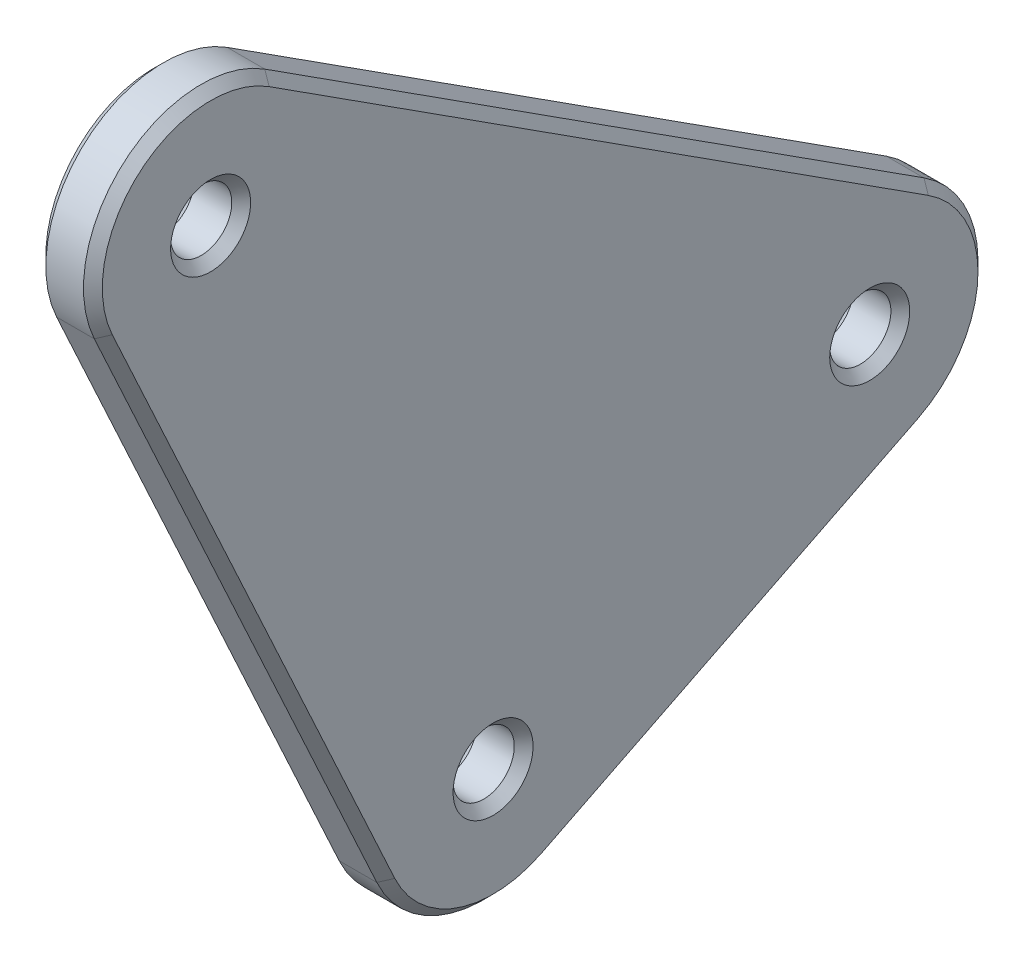
ISO-10303-21;
HEADER;
FILE_DESCRIPTION(('STEP AP214'),'2;1');
FILE_NAME('part.step','',(''),(''),'','','');
FILE_SCHEMA(('AUTOMOTIVE_DESIGN { 1 0 10303 214 1 1 1 1 }'));
ENDSEC;
DATA;
#1=APPLICATION_CONTEXT('core data for automotive mechanical design processes');
#2=APPLICATION_PROTOCOL_DEFINITION('international standard','automotive_design',2000,#1);
#3=PRODUCT_CONTEXT('',#1,'mechanical');
#4=PRODUCT('Part','Part','',(#3));
#5=PRODUCT_RELATED_PRODUCT_CATEGORY('part','',(#4));
#6=PRODUCT_DEFINITION_FORMATION('','',#4);
#7=PRODUCT_DEFINITION_CONTEXT('part definition',#1,'design');
#8=PRODUCT_DEFINITION('design','',#6,#7);
#9=PRODUCT_DEFINITION_SHAPE('','',#8);
#10=(LENGTH_UNIT() NAMED_UNIT(*) SI_UNIT(.MILLI.,.METRE.));
#11=(NAMED_UNIT(*) PLANE_ANGLE_UNIT() SI_UNIT($,.RADIAN.));
#12=(NAMED_UNIT(*) SI_UNIT($,.STERADIAN.) SOLID_ANGLE_UNIT());
#13=UNCERTAINTY_MEASURE_WITH_UNIT(LENGTH_MEASURE(1.E-05),#10,'distance_accuracy_value','');
#14=(GEOMETRIC_REPRESENTATION_CONTEXT(3) GLOBAL_UNCERTAINTY_ASSIGNED_CONTEXT((#13)) GLOBAL_UNIT_ASSIGNED_CONTEXT((#10,
#11,#12)) REPRESENTATION_CONTEXT('',''));
#15=CARTESIAN_POINT('',(0.,0.,0.));
#16=DIRECTION('',(0.,0.,1.));
#17=DIRECTION('',(1.,0.,0.));
#18=AXIS2_PLACEMENT_3D('',#15,#16,#17);
#19=CARTESIAN_POINT('',(1.5,10.000000011185,-20.));
#20=DIRECTION('',(-1.,0.,0.));
#21=DIRECTION('',(0.,0.,1.));
#22=AXIS2_PLACEMENT_3D('',#19,#20,#21);
#23=CYLINDRICAL_SURFACE('',#22,6.25);
#24=DIRECTION('',(-1.,0.,0.));
#25=VECTOR('',#24,1.);
#26=CARTESIAN_POINT('',(1.5,4.4098300686861,-22.7950849743758));
#27=LINE('',#26,#25);
#28=CARTESIAN_POINT('',(0.999999999999994,4.4098300686861,-22.7950849743758));
#29=VERTEX_POINT('',#28);
#30=CARTESIAN_POINT('',(-0.999999999999994,4.4098300686861,-22.7950849743758));
#31=VERTEX_POINT('',#30);
#32=EDGE_CURVE('E229',#29,#31,#27,.T.);
#33=ORIENTED_EDGE('',*,*,#32,.T.);
#34=CARTESIAN_POINT('',(-0.999999999999994,10.000000011185,-20.));
#35=DIRECTION('',(-1.,0.,0.));
#36=DIRECTION('',(0.,0.,1.));
#37=AXIS2_PLACEMENT_3D('',#34,#35,#36);
#38=CIRCLE('',#37,6.25);
#39=CARTESIAN_POINT('',(-0.999999999999994,15.2573654830527,-23.3797349445205));
#40=VERTEX_POINT('',#39);
#41=EDGE_CURVE('E181',#31,#40,#38,.F.);
#42=ORIENTED_EDGE('',*,*,#41,.T.);
#43=DIRECTION('',(-1.,0.,0.));
#44=VECTOR('',#43,1.);
#45=CARTESIAN_POINT('',(1.5,15.2573654830527,-23.3797349445205));
#46=LINE('',#45,#44);
#47=CARTESIAN_POINT('',(0.999999999999994,15.2573654830527,-23.3797349445205));
#48=VERTEX_POINT('',#47);
#49=EDGE_CURVE('E268',#48,#40,#46,.T.);
#50=ORIENTED_EDGE('',*,*,#49,.F.);
#51=CARTESIAN_POINT('',(0.999999999999994,10.000000011185,-20.));
#52=DIRECTION('',(-1.,0.,0.));
#53=DIRECTION('',(0.,0.,1.));
#54=AXIS2_PLACEMENT_3D('',#51,#52,#53);
#55=CIRCLE('',#54,6.25);
#56=EDGE_CURVE('E179',#48,#29,#55,.T.);
#57=ORIENTED_EDGE('',*,*,#56,.T.);
#58=EDGE_LOOP('',(#33,#42,#50,#57));
#59=FACE_BOUND('',#58,.T.);
#60=ADVANCED_FACE('F37',(#59),#23,.T.);
#61=CARTESIAN_POINT('',(1.5,37.7573654718677,11.6202650554794));
#62=DIRECTION('',(0.,0.841178475498832,-0.540757591123288));
#63=DIRECTION('',(0.,0.540757591123288,0.841178475498832));
#64=AXIS2_PLACEMENT_3D('',#61,#62,#63);
#65=PLANE('',#64);
#66=ORIENTED_EDGE('',*,*,#49,.T.);
#67=DIRECTION('',(0.,0.540757591123288,0.841178475498832));
#68=VECTOR('',#67,1.);
#69=CARTESIAN_POINT('',(-0.999999999999994,37.7573654718677,11.6202650554794));
#70=LINE('',#69,#68);
#71=CARTESIAN_POINT('',(-0.999999999999994,37.7573654718677,11.6202650554794));
#72=VERTEX_POINT('',#71);
#73=EDGE_CURVE('E134',#40,#72,#70,.T.);
#74=ORIENTED_EDGE('',*,*,#73,.T.);
#75=DIRECTION('',(-1.,0.,0.));
#76=VECTOR('',#75,1.);
#77=CARTESIAN_POINT('',(1.5,37.7573654718677,11.6202650554794));
#78=LINE('',#77,#76);
#79=CARTESIAN_POINT('',(0.999999999999994,37.7573654718677,11.6202650554794));
#80=VERTEX_POINT('',#79);
#81=EDGE_CURVE('E307',#80,#72,#78,.T.);
#82=ORIENTED_EDGE('',*,*,#81,.F.);
#83=DIRECTION('',(0.,-0.540757591123288,-0.841178475498832));
#84=VECTOR('',#83,1.);
#85=CARTESIAN_POINT('',(0.999999999999994,15.2573654830527,-23.3797349445205));
#86=LINE('',#85,#84);
#87=EDGE_CURVE('E154',#80,#48,#86,.T.);
#88=ORIENTED_EDGE('',*,*,#87,.T.);
#89=EDGE_LOOP('',(#66,#74,#82,#88));
#90=FACE_BOUND('',#89,.T.);
#91=ADVANCED_FACE('F306',(#90),#65,.T.);
#92=CARTESIAN_POINT('',(1.5,32.5,15.));
#93=DIRECTION('',(-1.,0.,0.));
#94=DIRECTION('',(0.,0.,1.));
#95=AXIS2_PLACEMENT_3D('',#92,#93,#94);
#96=CYLINDRICAL_SURFACE('',#95,6.25);
#97=ORIENTED_EDGE('',*,*,#81,.T.);
#98=CARTESIAN_POINT('',(-0.999999999999994,32.5,15.));
#99=DIRECTION('',(-1.,0.,0.));
#100=DIRECTION('',(0.,0.,1.));
#101=AXIS2_PLACEMENT_3D('',#98,#99,#100);
#102=CIRCLE('',#101,6.25);
#103=CARTESIAN_POINT('',(-0.999999999999994,29.8808863908641,20.6747461531278));
#104=VERTEX_POINT('',#103);
#105=EDGE_CURVE('E164',#72,#104,#102,.F.);
#106=ORIENTED_EDGE('',*,*,#105,.T.);
#107=DIRECTION('',(-1.,0.,0.));
#108=VECTOR('',#107,1.);
#109=CARTESIAN_POINT('',(1.5,29.8808863908641,20.6747461531278));
#110=LINE('',#109,#108);
#111=CARTESIAN_POINT('',(0.999999999999994,29.8808863908641,20.6747461531278));
#112=VERTEX_POINT('',#111);
#113=EDGE_CURVE('E309',#112,#104,#110,.T.);
#114=ORIENTED_EDGE('',*,*,#113,.F.);
#115=CARTESIAN_POINT('',(0.999999999999994,32.5,15.));
#116=DIRECTION('',(-1.,0.,0.));
#117=DIRECTION('',(0.,0.,1.));
#118=AXIS2_PLACEMENT_3D('',#115,#116,#117);
#119=CIRCLE('',#118,6.25);
#120=EDGE_CURVE('E162',#112,#80,#119,.T.);
#121=ORIENTED_EDGE('',*,*,#120,.T.);
#122=EDGE_LOOP('',(#97,#106,#114,#121));
#123=FACE_BOUND('',#122,.T.);
#124=ADVANCED_FACE('F308',(#123),#96,.T.);
#125=CARTESIAN_POINT('',(1.5,-2.61911360913592,5.67474615312783));
#126=DIRECTION('',(0.,-0.419058177461747,0.907959384500452));
#127=DIRECTION('',(0.,-0.907959384500452,-0.419058177461747));
#128=AXIS2_PLACEMENT_3D('',#125,#126,#127);
#129=PLANE('',#128);
#130=ORIENTED_EDGE('',*,*,#113,.T.);
#131=DIRECTION('',(0.,-0.907959384500452,-0.419058177461747));
#132=VECTOR('',#131,1.);
#133=CARTESIAN_POINT('',(-0.999999999999994,-2.61911360913592,5.67474615312783));
#134=LINE('',#133,#132);
#135=CARTESIAN_POINT('',(-0.999999999999994,-2.61911360913592,5.67474615312782));
#136=VERTEX_POINT('',#135);
#137=EDGE_CURVE('E168',#104,#136,#134,.T.);
#138=ORIENTED_EDGE('',*,*,#137,.T.);
#139=DIRECTION('',(-1.,0.,0.));
#140=VECTOR('',#139,1.);
#141=CARTESIAN_POINT('',(1.5,-2.61911360913592,5.67474615312782));
#142=LINE('',#141,#140);
#143=CARTESIAN_POINT('',(0.999999999999992,-2.61911360913592,5.67474615312782));
#144=VERTEX_POINT('',#143);
#145=EDGE_CURVE('E276',#144,#136,#142,.T.);
#146=ORIENTED_EDGE('',*,*,#145,.F.);
#147=DIRECTION('',(0.,0.907959384500452,0.419058177461747));
#148=VECTOR('',#147,1.);
#149=CARTESIAN_POINT('',(0.999999999999992,29.8808863908641,20.6747461531278));
#150=LINE('',#149,#148);
#151=EDGE_CURVE('E166',#144,#112,#150,.T.);
#152=ORIENTED_EDGE('',*,*,#151,.T.);
#153=EDGE_LOOP('',(#130,#138,#146,#152));
#154=FACE_BOUND('',#153,.T.);
#155=ADVANCED_FACE('F459',(#154),#129,.T.);
#156=CARTESIAN_POINT('',(1.5,0.,0.));
#157=DIRECTION('',(-1.,0.,0.));
#158=DIRECTION('',(0.,0.,1.));
#159=AXIS2_PLACEMENT_3D('',#156,#157,#158);
#160=CYLINDRICAL_SURFACE('',#159,6.25);
#161=ORIENTED_EDGE('',*,*,#145,.T.);
#162=CARTESIAN_POINT('',(-0.999999999999994,0.,0.));
#163=DIRECTION('',(-1.,0.,0.));
#164=DIRECTION('',(0.,0.,1.));
#165=AXIS2_PLACEMENT_3D('',#162,#163,#164);
#166=CIRCLE('',#165,6.25);
#167=CARTESIAN_POINT('',(-0.999999999999994,-5.59016994249895,-2.79508497437579));
#168=VERTEX_POINT('',#167);
#169=EDGE_CURVE('E172',#136,#168,#166,.F.);
#170=ORIENTED_EDGE('',*,*,#169,.T.);
#171=DIRECTION('',(-1.,0.,0.));
#172=VECTOR('',#171,1.);
#173=CARTESIAN_POINT('',(1.5,-5.59016994249895,-2.79508497437579));
#174=LINE('',#173,#172);
#175=CARTESIAN_POINT('',(0.999999999999994,-5.59016994249895,-2.79508497437579));
#176=VERTEX_POINT('',#175);
#177=EDGE_CURVE('E274',#176,#168,#174,.T.);
#178=ORIENTED_EDGE('',*,*,#177,.F.);
#179=CARTESIAN_POINT('',(0.999999999999994,0.,0.));
#180=DIRECTION('',(-1.,0.,0.));
#181=DIRECTION('',(0.,0.,1.));
#182=AXIS2_PLACEMENT_3D('',#179,#180,#181);
#183=CIRCLE('',#182,6.25);
#184=EDGE_CURVE('E170',#176,#144,#183,.T.);
#185=ORIENTED_EDGE('',*,*,#184,.T.);
#186=EDGE_LOOP('',(#161,#170,#178,#185));
#187=FACE_BOUND('',#186,.T.);
#188=ADVANCED_FACE('F317',(#187),#160,.T.);
#189=CARTESIAN_POINT('',(1.5,4.4098300686861,-22.7950849743758));
#190=DIRECTION('',(0.,-0.894427190799832,-0.447213595900126));
#191=DIRECTION('',(0.,0.447213595900126,-0.894427190799832));
#192=AXIS2_PLACEMENT_3D('',#189,#190,#191);
#193=PLANE('',#192);
#194=ORIENTED_EDGE('',*,*,#177,.T.);
#195=DIRECTION('',(0.,0.447213595900126,-0.894427190799832));
#196=VECTOR('',#195,1.);
#197=CARTESIAN_POINT('',(-0.999999999999994,4.4098300686861,-22.7950849743758));
#198=LINE('',#197,#196);
#199=EDGE_CURVE('E177',#168,#31,#198,.T.);
#200=ORIENTED_EDGE('',*,*,#199,.T.);
#201=ORIENTED_EDGE('',*,*,#32,.F.);
#202=DIRECTION('',(0.,-0.447213595900126,0.894427190799832));
#203=VECTOR('',#202,1.);
#204=CARTESIAN_POINT('',(0.999999999999995,-5.59016994249895,-2.79508497437579));
#205=LINE('',#204,#203);
#206=EDGE_CURVE('E174',#29,#176,#205,.T.);
#207=ORIENTED_EDGE('',*,*,#206,.T.);
#208=EDGE_LOOP('',(#194,#200,#201,#207));
#209=FACE_BOUND('',#208,.T.);
#210=ADVANCED_FACE('F271',(#209),#193,.T.);
#211=CARTESIAN_POINT('',(1.5,10.000000011185,-20.));
#212=DIRECTION('',(-1.,0.,0.));
#213=DIRECTION('',(0.,0.,1.));
#214=AXIS2_PLACEMENT_3D('',#211,#212,#213);
#215=PLANE('',#214);
#216=CARTESIAN_POINT('',(1.5,0.,0.));
#217=DIRECTION('',(-1.,0.,0.));
#218=DIRECTION('',(0.,0.,1.));
#219=AXIS2_PLACEMENT_3D('',#216,#217,#218);
#220=CIRCLE('',#219,5.75);
#221=CARTESIAN_POINT('',(1.5,-2.40958452040505,5.2207664608776));
#222=VERTEX_POINT('',#221);
#223=CARTESIAN_POINT('',(1.5,-5.14295634709903,-2.57147817642572));
#224=VERTEX_POINT('',#223);
#225=EDGE_CURVE('E47',#222,#224,#220,.F.);
#226=ORIENTED_EDGE('',*,*,#225,.T.);
#227=DIRECTION('',(0.,0.447213595900126,-0.894427190799832));
#228=VECTOR('',#227,1.);
#229=CARTESIAN_POINT('',(1.5,4.85704366408602,-22.5714781764257));
#230=LINE('',#229,#228);
#231=CARTESIAN_POINT('',(1.5,4.85704366408602,-22.5714781764257));
#232=VERTEX_POINT('',#231);
#233=EDGE_CURVE('E12',#224,#232,#230,.T.);
#234=ORIENTED_EDGE('',*,*,#233,.T.);
#235=CARTESIAN_POINT('',(1.5,10.000000011185,-20.));
#236=DIRECTION('',(-1.,0.,0.));
#237=DIRECTION('',(0.,0.,1.));
#238=AXIS2_PLACEMENT_3D('',#235,#236,#237);
#239=CIRCLE('',#238,5.75);
#240=CARTESIAN_POINT('',(1.5,14.8367762453033,-23.1093561489589));
#241=VERTEX_POINT('',#240);
#242=EDGE_CURVE('E210',#232,#241,#239,.F.);
#243=ORIENTED_EDGE('',*,*,#242,.T.);
#244=DIRECTION('',(0.,0.540757591123288,0.841178475498832));
#245=VECTOR('',#244,1.);
#246=CARTESIAN_POINT('',(1.5,37.3367762341183,11.8906438510411));
#247=LINE('',#246,#245);
#248=CARTESIAN_POINT('',(1.5,37.3367762341183,11.8906438510411));
#249=VERTEX_POINT('',#248);
#250=EDGE_CURVE('E212',#241,#249,#247,.T.);
#251=ORIENTED_EDGE('',*,*,#250,.T.);
#252=CARTESIAN_POINT('',(1.5,32.5,15.));
#253=DIRECTION('',(-1.,0.,0.));
#254=DIRECTION('',(0.,0.,1.));
#255=AXIS2_PLACEMENT_3D('',#252,#253,#254);
#256=CIRCLE('',#255,5.75);
#257=CARTESIAN_POINT('',(1.5,30.090415479595,20.2207664608776));
#258=VERTEX_POINT('',#257);
#259=EDGE_CURVE('E214',#249,#258,#256,.F.);
#260=ORIENTED_EDGE('',*,*,#259,.T.);
#261=DIRECTION('',(0.,-0.907959384500452,-0.419058177461747));
#262=VECTOR('',#261,1.);
#263=CARTESIAN_POINT('',(1.5,-2.40958452040505,5.2207664608776));
#264=LINE('',#263,#262);
#265=EDGE_CURVE('E58',#258,#222,#264,.T.);
#266=ORIENTED_EDGE('',*,*,#265,.T.);
#267=EDGE_LOOP('',(#226,#234,#243,#251,#260,#266));
#268=FACE_BOUND('',#267,.T.);
#269=CARTESIAN_POINT('',(1.5,0.,0.));
#270=DIRECTION('',(-1.,0.,0.));
#271=DIRECTION('',(0.,0.,1.));
#272=AXIS2_PLACEMENT_3D('',#269,#270,#271);
#273=CIRCLE('',#272,2.125);
#274=CARTESIAN_POINT('',(1.5,0.,2.125));
#275=VERTEX_POINT('',#274);
#276=EDGE_CURVE('E207',#275,#275,#273,.T.);
#277=ORIENTED_EDGE('',*,*,#276,.T.);
#278=EDGE_LOOP('',(#277));
#279=FACE_BOUND('',#278,.T.);
#280=CARTESIAN_POINT('',(1.5,32.5,15.));
#281=DIRECTION('',(-1.,0.,0.));
#282=DIRECTION('',(0.,0.,1.));
#283=AXIS2_PLACEMENT_3D('',#280,#281,#282);
#284=CIRCLE('',#283,2.125);
#285=CARTESIAN_POINT('',(1.5,32.5,17.125));
#286=VERTEX_POINT('',#285);
#287=EDGE_CURVE('E204',#286,#286,#284,.T.);
#288=ORIENTED_EDGE('',*,*,#287,.T.);
#289=EDGE_LOOP('',(#288));
#290=FACE_BOUND('',#289,.T.);
#291=CARTESIAN_POINT('',(1.5,10.000000011185,-20.));
#292=DIRECTION('',(-1.,0.,0.));
#293=DIRECTION('',(0.,0.,1.));
#294=AXIS2_PLACEMENT_3D('',#291,#292,#293);
#295=CIRCLE('',#294,2.125);
#296=CARTESIAN_POINT('',(1.5,10.000000011185,-17.875));
#297=VERTEX_POINT('',#296);
#298=EDGE_CURVE('E201',#297,#297,#295,.T.);
#299=ORIENTED_EDGE('',*,*,#298,.T.);
#300=EDGE_LOOP('',(#299));
#301=FACE_BOUND('',#300,.T.);
#302=ADVANCED_FACE('F255',(#268,#279,#290,#301),#215,.F.);
#303=CARTESIAN_POINT('',(-1.5,10.000000011185,-20.));
#304=DIRECTION('',(-1.,0.,0.));
#305=DIRECTION('',(0.,0.,1.));
#306=AXIS2_PLACEMENT_3D('',#303,#304,#305);
#307=PLANE('',#306);
#308=CARTESIAN_POINT('',(-1.5,32.5,15.));
#309=DIRECTION('',(-1.,0.,0.));
#310=DIRECTION('',(0.,0.,1.));
#311=AXIS2_PLACEMENT_3D('',#308,#309,#310);
#312=CIRCLE('',#311,5.75);
#313=CARTESIAN_POINT('',(-1.5,30.090415479595,20.2207664608776));
#314=VERTEX_POINT('',#313);
#315=CARTESIAN_POINT('',(-1.5,37.3367762341183,11.8906438510411));
#316=VERTEX_POINT('',#315);
#317=EDGE_CURVE('E152',#314,#316,#312,.T.);
#318=ORIENTED_EDGE('',*,*,#317,.T.);
#319=DIRECTION('',(0.,-0.540757591123288,-0.841178475498832));
#320=VECTOR('',#319,1.);
#321=CARTESIAN_POINT('',(-1.5,14.8367762453033,-23.1093561489589));
#322=LINE('',#321,#320);
#323=CARTESIAN_POINT('',(-1.5,14.8367762453033,-23.1093561489589));
#324=VERTEX_POINT('',#323);
#325=EDGE_CURVE('E132',#316,#324,#322,.T.);
#326=ORIENTED_EDGE('',*,*,#325,.T.);
#327=CARTESIAN_POINT('',(-1.5,10.000000011185,-20.));
#328=DIRECTION('',(-1.,0.,0.));
#329=DIRECTION('',(0.,0.,1.));
#330=AXIS2_PLACEMENT_3D('',#327,#328,#329);
#331=CIRCLE('',#330,5.75);
#332=CARTESIAN_POINT('',(-1.5,4.85704366408601,-22.5714781764257));
#333=VERTEX_POINT('',#332);
#334=EDGE_CURVE('E140',#324,#333,#331,.T.);
#335=ORIENTED_EDGE('',*,*,#334,.T.);
#336=DIRECTION('',(0.,-0.447213595900126,0.894427190799832));
#337=VECTOR('',#336,1.);
#338=CARTESIAN_POINT('',(-1.5,4.85704366408601,-22.5714781764257));
#339=LINE('',#338,#337);
#340=CARTESIAN_POINT('',(-1.5,-5.14295634709903,-2.57147817642573));
#341=VERTEX_POINT('',#340);
#342=EDGE_CURVE('E146',#333,#341,#339,.T.);
#343=ORIENTED_EDGE('',*,*,#342,.T.);
#344=CARTESIAN_POINT('',(-1.5,0.,0.));
#345=DIRECTION('',(-1.,0.,0.));
#346=DIRECTION('',(0.,0.,1.));
#347=AXIS2_PLACEMENT_3D('',#344,#345,#346);
#348=CIRCLE('',#347,5.75);
#349=CARTESIAN_POINT('',(-1.5,-2.40958452040505,5.2207664608776));
#350=VERTEX_POINT('',#349);
#351=EDGE_CURVE('E289',#341,#350,#348,.T.);
#352=ORIENTED_EDGE('',*,*,#351,.T.);
#353=DIRECTION('',(0.,0.907959384500452,0.419058177461747));
#354=VECTOR('',#353,1.);
#355=CARTESIAN_POINT('',(-1.5,-1.77543816972079,5.51344939196264));
#356=LINE('',#355,#354);
#357=EDGE_CURVE('E157',#350,#314,#356,.T.);
#358=ORIENTED_EDGE('',*,*,#357,.T.);
#359=EDGE_LOOP('',(#318,#326,#335,#343,#352,#358));
#360=FACE_BOUND('',#359,.T.);
#361=CARTESIAN_POINT('',(-1.5,0.,0.));
#362=DIRECTION('',(-1.,0.,0.));
#363=DIRECTION('',(0.,0.,1.));
#364=AXIS2_PLACEMENT_3D('',#361,#362,#363);
#365=CIRCLE('',#364,2.125);
#366=CARTESIAN_POINT('',(-1.5,0.,2.125));
#367=VERTEX_POINT('',#366);
#368=EDGE_CURVE('E147',#367,#367,#365,.F.);
#369=ORIENTED_EDGE('',*,*,#368,.T.);
#370=EDGE_LOOP('',(#369));
#371=FACE_BOUND('',#370,.T.);
#372=CARTESIAN_POINT('',(-1.5,32.5,15.));
#373=DIRECTION('',(-1.,0.,0.));
#374=DIRECTION('',(0.,0.,1.));
#375=AXIS2_PLACEMENT_3D('',#372,#373,#374);
#376=CIRCLE('',#375,2.12499999999999);
#377=CARTESIAN_POINT('',(-1.5,32.5,17.125));
#378=VERTEX_POINT('',#377);
#379=EDGE_CURVE('E283',#378,#378,#376,.F.);
#380=ORIENTED_EDGE('',*,*,#379,.T.);
#381=EDGE_LOOP('',(#380));
#382=FACE_BOUND('',#381,.T.);
#383=CARTESIAN_POINT('',(-1.5,10.000000011185,-20.));
#384=DIRECTION('',(-1.,0.,0.));
#385=DIRECTION('',(0.,0.,1.));
#386=AXIS2_PLACEMENT_3D('',#383,#384,#385);
#387=CIRCLE('',#386,2.125);
#388=CARTESIAN_POINT('',(-1.5,10.000000011185,-17.875));
#389=VERTEX_POINT('',#388);
#390=EDGE_CURVE('E280',#389,#389,#387,.F.);
#391=ORIENTED_EDGE('',*,*,#390,.T.);
#392=EDGE_LOOP('',(#391));
#393=FACE_BOUND('',#392,.T.);
#394=ADVANCED_FACE('F149',(#360,#371,#382,#393),#307,.T.);
#395=CARTESIAN_POINT('',(1.5,0.,0.));
#396=DIRECTION('',(-1.,0.,0.));
#397=DIRECTION('',(0.,0.,1.));
#398=AXIS2_PLACEMENT_3D('',#395,#396,#397);
#399=CYLINDRICAL_SURFACE('',#398,1.625);
#400=CARTESIAN_POINT('',(-1.00000000000001,0.,0.));
#401=DIRECTION('',(-1.,0.,0.));
#402=DIRECTION('',(0.,0.,1.));
#403=AXIS2_PLACEMENT_3D('',#400,#401,#402);
#404=CIRCLE('',#403,1.625);
#405=CARTESIAN_POINT('',(-1.00000000000001,0.,1.625));
#406=VERTEX_POINT('',#405);
#407=EDGE_CURVE('E186',#406,#406,#404,.T.);
#408=ORIENTED_EDGE('',*,*,#407,.T.);
#409=EDGE_LOOP('',(#408));
#410=FACE_BOUND('',#409,.T.);
#411=CARTESIAN_POINT('',(1.,0.,0.));
#412=DIRECTION('',(-1.,0.,0.));
#413=DIRECTION('',(0.,0.,1.));
#414=AXIS2_PLACEMENT_3D('',#411,#412,#413);
#415=CIRCLE('',#414,1.625);
#416=CARTESIAN_POINT('',(1.,0.,1.625));
#417=VERTEX_POINT('',#416);
#418=EDGE_CURVE('E183',#417,#417,#415,.F.);
#419=ORIENTED_EDGE('',*,*,#418,.T.);
#420=EDGE_LOOP('',(#419));
#421=FACE_BOUND('',#420,.T.);
#422=ADVANCED_FACE('F452',(#410,#421),#399,.F.);
#423=CARTESIAN_POINT('',(1.5,32.5,15.));
#424=DIRECTION('',(-1.,0.,0.));
#425=DIRECTION('',(0.,0.,1.));
#426=AXIS2_PLACEMENT_3D('',#423,#424,#425);
#427=CYLINDRICAL_SURFACE('',#426,1.625);
#428=CARTESIAN_POINT('',(-1.00000000000001,32.5,15.));
#429=DIRECTION('',(-1.,0.,0.));
#430=DIRECTION('',(0.,0.,1.));
#431=AXIS2_PLACEMENT_3D('',#428,#429,#430);
#432=CIRCLE('',#431,1.625);
#433=CARTESIAN_POINT('',(-1.00000000000001,32.5,16.625));
#434=VERTEX_POINT('',#433);
#435=EDGE_CURVE('E192',#434,#434,#432,.T.);
#436=ORIENTED_EDGE('',*,*,#435,.T.);
#437=EDGE_LOOP('',(#436));
#438=FACE_BOUND('',#437,.T.);
#439=CARTESIAN_POINT('',(1.,32.5,15.));
#440=DIRECTION('',(-1.,0.,0.));
#441=DIRECTION('',(0.,0.,1.));
#442=AXIS2_PLACEMENT_3D('',#439,#440,#441);
#443=CIRCLE('',#442,1.625);
#444=CARTESIAN_POINT('',(1.,32.5,16.625));
#445=VERTEX_POINT('',#444);
#446=EDGE_CURVE('E189',#445,#445,#443,.F.);
#447=ORIENTED_EDGE('',*,*,#446,.T.);
#448=EDGE_LOOP('',(#447));
#449=FACE_BOUND('',#448,.T.);
#450=ADVANCED_FACE('F480',(#438,#449),#427,.F.);
#451=CARTESIAN_POINT('',(1.5,10.000000011185,-20.));
#452=DIRECTION('',(-1.,0.,0.));
#453=DIRECTION('',(0.,0.,1.));
#454=AXIS2_PLACEMENT_3D('',#451,#452,#453);
#455=CYLINDRICAL_SURFACE('',#454,1.625);
#456=CARTESIAN_POINT('',(-1.,10.000000011185,-20.));
#457=DIRECTION('',(-1.,0.,0.));
#458=DIRECTION('',(0.,0.,1.));
#459=AXIS2_PLACEMENT_3D('',#456,#457,#458);
#460=CIRCLE('',#459,1.625);
#461=CARTESIAN_POINT('',(-1.,10.000000011185,-18.375));
#462=VERTEX_POINT('',#461);
#463=EDGE_CURVE('E198',#462,#462,#460,.T.);
#464=ORIENTED_EDGE('',*,*,#463,.T.);
#465=EDGE_LOOP('',(#464));
#466=FACE_BOUND('',#465,.T.);
#467=CARTESIAN_POINT('',(0.999999999999996,10.000000011185,-20.));
#468=DIRECTION('',(-1.,0.,0.));
#469=DIRECTION('',(0.,0.,1.));
#470=AXIS2_PLACEMENT_3D('',#467,#468,#469);
#471=CIRCLE('',#470,1.625);
#472=CARTESIAN_POINT('',(0.999999999999996,10.000000011185,-18.375));
#473=VERTEX_POINT('',#472);
#474=EDGE_CURVE('E195',#473,#473,#471,.F.);
#475=ORIENTED_EDGE('',*,*,#474,.T.);
#476=EDGE_LOOP('',(#475));
#477=FACE_BOUND('',#476,.T.);
#478=ADVANCED_FACE('F368',(#466,#477),#455,.F.);
#479=CARTESIAN_POINT('',(-1.5,0.,0.));
#480=DIRECTION('',(1.,0.,0.));
#481=DIRECTION('',(0.,0.,-1.));
#482=AXIS2_PLACEMENT_3D('',#479,#480,#481);
#483=CONICAL_SURFACE('',#482,5.75,0.785398163397443);
#484=DIRECTION('',(-0.707106781186551,0.632455531892192,0.316227766299798));
#485=VECTOR('',#484,1.);
#486=CARTESIAN_POINT('',(-0.999999999999994,-5.59016994249895,-2.79508497437579));
#487=LINE('',#486,#485);
#488=EDGE_CURVE('E223',#168,#341,#487,.T.);
#489=ORIENTED_EDGE('',*,*,#488,.F.);
#490=ORIENTED_EDGE('',*,*,#169,.F.);
#491=DIRECTION('',(0.707106781186551,-0.296318878994876,0.64202423782223));
#492=VECTOR('',#491,1.);
#493=CARTESIAN_POINT('',(-1.5,-2.40958452040505,5.2207664608776));
#494=LINE('',#493,#492);
#495=EDGE_CURVE('E226',#350,#136,#494,.T.);
#496=ORIENTED_EDGE('',*,*,#495,.F.);
#497=ORIENTED_EDGE('',*,*,#351,.F.);
#498=EDGE_LOOP('',(#489,#490,#496,#497));
#499=FACE_BOUND('',#498,.T.);
#500=ADVANCED_FACE('F322',(#499),#483,.T.);
#501=CARTESIAN_POINT('',(-1.5,-1.77543816972079,5.51344939196264));
#502=DIRECTION('',(0.707106781186543,0.296318878994879,-0.642024237822238));
#503=DIRECTION('',(0.,0.907959384500452,0.419058177461747));
#504=AXIS2_PLACEMENT_3D('',#501,#502,#503);
#505=PLANE('',#504);
#506=ORIENTED_EDGE('',*,*,#495,.T.);
#507=ORIENTED_EDGE('',*,*,#137,.F.);
#508=DIRECTION('',(0.70710678118655,-0.296318878994874,0.642024237822232));
#509=VECTOR('',#508,1.);
#510=CARTESIAN_POINT('',(-1.5,30.090415479595,20.2207664608776));
#511=LINE('',#510,#509);
#512=EDGE_CURVE('E220',#314,#104,#511,.T.);
#513=ORIENTED_EDGE('',*,*,#512,.F.);
#514=ORIENTED_EDGE('',*,*,#357,.F.);
#515=EDGE_LOOP('',(#506,#507,#513,#514));
#516=FACE_BOUND('',#515,.T.);
#517=ADVANCED_FACE('F296',(#516),#505,.F.);
#518=CARTESIAN_POINT('',(-1.5,4.85704366408601,-22.5714781764257));
#519=DIRECTION('',(0.707106781186544,0.632455531892198,0.316227766299801));
#520=DIRECTION('',(0.,-0.447213595900126,0.894427190799832));
#521=AXIS2_PLACEMENT_3D('',#518,#519,#520);
#522=PLANE('',#521);
#523=ORIENTED_EDGE('',*,*,#488,.T.);
#524=ORIENTED_EDGE('',*,*,#342,.F.);
#525=DIRECTION('',(-0.707106781186551,0.632455531892191,0.316227766299799));
#526=VECTOR('',#525,1.);
#527=CARTESIAN_POINT('',(-0.999999999999994,4.4098300686861,-22.7950849743758));
#528=LINE('',#527,#526);
#529=EDGE_CURVE('E143',#31,#333,#528,.T.);
#530=ORIENTED_EDGE('',*,*,#529,.F.);
#531=ORIENTED_EDGE('',*,*,#199,.F.);
#532=EDGE_LOOP('',(#523,#524,#530,#531));
#533=FACE_BOUND('',#532,.T.);
#534=ADVANCED_FACE('F324',(#533),#522,.F.);
#535=CARTESIAN_POINT('',(-1.5,32.5,15.));
#536=DIRECTION('',(1.,0.,0.));
#537=DIRECTION('',(0.,0.,-1.));
#538=AXIS2_PLACEMENT_3D('',#535,#536,#537);
#539=CONICAL_SURFACE('',#538,5.75,0.785398163397441);
#540=ORIENTED_EDGE('',*,*,#512,.T.);
#541=ORIENTED_EDGE('',*,*,#105,.F.);
#542=DIRECTION('',(0.707106781186551,0.594803004213382,-0.382373359661379));
#543=VECTOR('',#542,1.);
#544=CARTESIAN_POINT('',(-1.5,37.3367762341183,11.8906438510411));
#545=LINE('',#544,#543);
#546=EDGE_CURVE('E137',#316,#72,#545,.T.);
#547=ORIENTED_EDGE('',*,*,#546,.F.);
#548=ORIENTED_EDGE('',*,*,#317,.F.);
#549=EDGE_LOOP('',(#540,#541,#547,#548));
#550=FACE_BOUND('',#549,.T.);
#551=ADVANCED_FACE('F299',(#550),#539,.T.);
#552=CARTESIAN_POINT('',(-1.5,10.000000011185,-20.));
#553=DIRECTION('',(1.,0.,0.));
#554=DIRECTION('',(0.,0.,-1.));
#555=AXIS2_PLACEMENT_3D('',#552,#553,#554);
#556=CONICAL_SURFACE('',#555,5.75,0.785398163397443);
#557=ORIENTED_EDGE('',*,*,#529,.T.);
#558=ORIENTED_EDGE('',*,*,#334,.F.);
#559=DIRECTION('',(-0.707106781186551,-0.594803004213382,0.382373359661379));
#560=VECTOR('',#559,1.);
#561=CARTESIAN_POINT('',(-0.999999999999994,15.2573654830527,-23.3797349445205));
#562=LINE('',#561,#560);
#563=EDGE_CURVE('E128',#40,#324,#562,.T.);
#564=ORIENTED_EDGE('',*,*,#563,.F.);
#565=ORIENTED_EDGE('',*,*,#41,.F.);
#566=EDGE_LOOP('',(#557,#558,#564,#565));
#567=FACE_BOUND('',#566,.T.);
#568=ADVANCED_FACE('F141',(#567),#556,.T.);
#569=CARTESIAN_POINT('',(-1.5,14.8367762453033,-23.1093561489589));
#570=DIRECTION('',(0.707106781186541,-0.594803004213392,0.382373359661383));
#571=DIRECTION('',(0.,-0.540757591123288,-0.841178475498832));
#572=AXIS2_PLACEMENT_3D('',#569,#570,#571);
#573=PLANE('',#572);
#574=ORIENTED_EDGE('',*,*,#546,.T.);
#575=ORIENTED_EDGE('',*,*,#73,.F.);
#576=ORIENTED_EDGE('',*,*,#563,.T.);
#577=ORIENTED_EDGE('',*,*,#325,.F.);
#578=EDGE_LOOP('',(#574,#575,#576,#577));
#579=FACE_BOUND('',#578,.T.);
#580=ADVANCED_FACE('F130',(#579),#573,.F.);
#581=CARTESIAN_POINT('',(-1.00000000000001,0.,0.));
#582=DIRECTION('',(-1.,0.,0.));
#583=DIRECTION('',(0.,0.,1.));
#584=AXIS2_PLACEMENT_3D('',#581,#582,#583);
#585=CONICAL_SURFACE('',#584,1.625,0.785398163397449);
#586=ORIENTED_EDGE('',*,*,#368,.F.);
#587=EDGE_LOOP('',(#586));
#588=FACE_BOUND('',#587,.T.);
#589=ORIENTED_EDGE('',*,*,#407,.F.);
#590=EDGE_LOOP('',(#589));
#591=FACE_BOUND('',#590,.T.);
#592=ADVANCED_FACE('F350',(#588,#591),#585,.F.);
#593=CARTESIAN_POINT('',(-1.00000000000001,32.5,15.));
#594=DIRECTION('',(-1.,0.,0.));
#595=DIRECTION('',(0.,0.,1.));
#596=AXIS2_PLACEMENT_3D('',#593,#594,#595);
#597=CONICAL_SURFACE('',#596,1.625,0.785398163397448);
#598=ORIENTED_EDGE('',*,*,#379,.F.);
#599=EDGE_LOOP('',(#598));
#600=FACE_BOUND('',#599,.T.);
#601=ORIENTED_EDGE('',*,*,#435,.F.);
#602=EDGE_LOOP('',(#601));
#603=FACE_BOUND('',#602,.T.);
#604=ADVANCED_FACE('F374',(#600,#603),#597,.F.);
#605=CARTESIAN_POINT('',(-1.,10.000000011185,-20.));
#606=DIRECTION('',(-1.,0.,0.));
#607=DIRECTION('',(0.,0.,1.));
#608=AXIS2_PLACEMENT_3D('',#605,#606,#607);
#609=CONICAL_SURFACE('',#608,1.625,0.785398163397449);
#610=ORIENTED_EDGE('',*,*,#390,.F.);
#611=EDGE_LOOP('',(#610));
#612=FACE_BOUND('',#611,.T.);
#613=ORIENTED_EDGE('',*,*,#463,.F.);
#614=EDGE_LOOP('',(#613));
#615=FACE_BOUND('',#614,.T.);
#616=ADVANCED_FACE('F381',(#612,#615),#609,.F.);
#617=CARTESIAN_POINT('',(0.999999999999994,32.5,15.));
#618=DIRECTION('',(-1.,0.,0.));
#619=DIRECTION('',(0.,0.,1.));
#620=AXIS2_PLACEMENT_3D('',#617,#618,#619);
#621=CONICAL_SURFACE('',#620,6.25,0.785398163397446);
#622=DIRECTION('',(-0.707106781186549,-0.296318878994878,0.642024237822231));
#623=VECTOR('',#622,1.);
#624=CARTESIAN_POINT('',(1.5,30.090415479595,20.2207664608776));
#625=LINE('',#624,#623);
#626=EDGE_CURVE('E239',#258,#112,#625,.T.);
#627=ORIENTED_EDGE('',*,*,#626,.F.);
#628=ORIENTED_EDGE('',*,*,#259,.F.);
#629=DIRECTION('',(0.70710678118655,-0.594803004213382,0.382373359661381));
#630=VECTOR('',#629,1.);
#631=CARTESIAN_POINT('',(0.999999999999994,37.7573654718677,11.6202650554794));
#632=LINE('',#631,#630);
#633=EDGE_CURVE('E42',#80,#249,#632,.T.);
#634=ORIENTED_EDGE('',*,*,#633,.F.);
#635=ORIENTED_EDGE('',*,*,#120,.F.);
#636=EDGE_LOOP('',(#627,#628,#634,#635));
#637=FACE_BOUND('',#636,.T.);
#638=ADVANCED_FACE('F254',(#637),#621,.T.);
#639=CARTESIAN_POINT('',(0.999999999999994,37.7573654718677,11.6202650554794));
#640=DIRECTION('',(0.707106781186553,0.594803004213381,-0.382373359661377));
#641=DIRECTION('',(0.,0.540757591123288,0.841178475498832));
#642=AXIS2_PLACEMENT_3D('',#639,#640,#641);
#643=PLANE('',#642);
#644=ORIENTED_EDGE('',*,*,#633,.T.);
#645=ORIENTED_EDGE('',*,*,#250,.F.);
#646=DIRECTION('',(0.707106781186535,-0.594803004213398,0.382373359661385));
#647=VECTOR('',#646,1.);
#648=CARTESIAN_POINT('',(0.999999999999994,15.2573654830527,-23.3797349445205));
#649=LINE('',#648,#647);
#650=EDGE_CURVE('E237',#48,#241,#649,.T.);
#651=ORIENTED_EDGE('',*,*,#650,.F.);
#652=ORIENTED_EDGE('',*,*,#87,.F.);
#653=EDGE_LOOP('',(#644,#645,#651,#652));
#654=FACE_BOUND('',#653,.T.);
#655=ADVANCED_FACE('F249',(#654),#643,.T.);
#656=CARTESIAN_POINT('',(0.999999999999994,-2.61911360913592,5.67474615312783));
#657=DIRECTION('',(0.707106781186545,-0.296318878994878,0.642024237822235));
#658=DIRECTION('',(0.,-0.907959384500452,-0.419058177461747));
#659=AXIS2_PLACEMENT_3D('',#656,#657,#658);
#660=PLANE('',#659);
#661=ORIENTED_EDGE('',*,*,#626,.T.);
#662=ORIENTED_EDGE('',*,*,#151,.F.);
#663=DIRECTION('',(-0.707106781186551,-0.296318878994875,0.64202423782223));
#664=VECTOR('',#663,1.);
#665=CARTESIAN_POINT('',(1.5,-2.40958452040505,5.2207664608776));
#666=LINE('',#665,#664);
#667=EDGE_CURVE('E234',#222,#144,#666,.T.);
#668=ORIENTED_EDGE('',*,*,#667,.F.);
#669=ORIENTED_EDGE('',*,*,#265,.F.);
#670=EDGE_LOOP('',(#661,#662,#668,#669));
#671=FACE_BOUND('',#670,.T.);
#672=ADVANCED_FACE('F411',(#671),#660,.T.);
#673=CARTESIAN_POINT('',(0.999999999999994,10.000000011185,-20.));
#674=DIRECTION('',(-1.,0.,0.));
#675=DIRECTION('',(0.,0.,1.));
#676=AXIS2_PLACEMENT_3D('',#673,#674,#675);
#677=CONICAL_SURFACE('',#676,6.25,0.785398163397447);
#678=ORIENTED_EDGE('',*,*,#650,.T.);
#679=ORIENTED_EDGE('',*,*,#242,.F.);
#680=DIRECTION('',(0.707106781186548,0.632455531892195,0.316227766299798));
#681=VECTOR('',#680,1.);
#682=CARTESIAN_POINT('',(0.999999999999994,4.4098300686861,-22.7950849743758));
#683=LINE('',#682,#681);
#684=EDGE_CURVE('E232',#29,#232,#683,.T.);
#685=ORIENTED_EDGE('',*,*,#684,.F.);
#686=ORIENTED_EDGE('',*,*,#56,.F.);
#687=EDGE_LOOP('',(#678,#679,#685,#686));
#688=FACE_BOUND('',#687,.T.);
#689=ADVANCED_FACE('F260',(#688),#677,.T.);
#690=CARTESIAN_POINT('',(0.999999999999994,0.,0.));
#691=DIRECTION('',(-1.,0.,0.));
#692=DIRECTION('',(0.,0.,1.));
#693=AXIS2_PLACEMENT_3D('',#690,#691,#692);
#694=CONICAL_SURFACE('',#693,6.25,0.785398163397447);
#695=ORIENTED_EDGE('',*,*,#667,.T.);
#696=ORIENTED_EDGE('',*,*,#184,.F.);
#697=DIRECTION('',(-0.707106781186548,-0.632455531892195,-0.316227766299799));
#698=VECTOR('',#697,1.);
#699=CARTESIAN_POINT('',(1.5,-5.14295634709903,-2.57147817642572));
#700=LINE('',#699,#698);
#701=EDGE_CURVE('E230',#224,#176,#700,.T.);
#702=ORIENTED_EDGE('',*,*,#701,.F.);
#703=ORIENTED_EDGE('',*,*,#225,.F.);
#704=EDGE_LOOP('',(#695,#696,#702,#703));
#705=FACE_BOUND('',#704,.T.);
#706=ADVANCED_FACE('F398',(#705),#694,.T.);
#707=CARTESIAN_POINT('',(0.999999999999994,4.4098300686861,-22.7950849743758));
#708=DIRECTION('',(0.707106781186545,-0.632455531892197,-0.316227766299801));
#709=DIRECTION('',(0.,0.447213595900126,-0.894427190799832));
#710=AXIS2_PLACEMENT_3D('',#707,#708,#709);
#711=PLANE('',#710);
#712=ORIENTED_EDGE('',*,*,#684,.T.);
#713=ORIENTED_EDGE('',*,*,#233,.F.);
#714=ORIENTED_EDGE('',*,*,#701,.T.);
#715=ORIENTED_EDGE('',*,*,#206,.F.);
#716=EDGE_LOOP('',(#712,#713,#714,#715));
#717=FACE_BOUND('',#716,.T.);
#718=ADVANCED_FACE('F390',(#717),#711,.T.);
#719=CARTESIAN_POINT('',(1.5,0.,0.));
#720=DIRECTION('',(1.,0.,0.));
#721=DIRECTION('',(0.,0.,-1.));
#722=AXIS2_PLACEMENT_3D('',#719,#720,#721);
#723=CONICAL_SURFACE('',#722,2.125,0.785398163397447);
#724=ORIENTED_EDGE('',*,*,#418,.F.);
#725=EDGE_LOOP('',(#724));
#726=FACE_BOUND('',#725,.T.);
#727=ORIENTED_EDGE('',*,*,#276,.F.);
#728=EDGE_LOOP('',(#727));
#729=FACE_BOUND('',#728,.T.);
#730=ADVANCED_FACE('F397',(#726,#729),#723,.F.);
#731=CARTESIAN_POINT('',(1.5,32.5,15.));
#732=DIRECTION('',(1.,0.,0.));
#733=DIRECTION('',(0.,0.,-1.));
#734=AXIS2_PLACEMENT_3D('',#731,#732,#733);
#735=CONICAL_SURFACE('',#734,2.125,0.785398163397449);
#736=ORIENTED_EDGE('',*,*,#446,.F.);
#737=EDGE_LOOP('',(#736));
#738=FACE_BOUND('',#737,.T.);
#739=ORIENTED_EDGE('',*,*,#287,.F.);
#740=EDGE_LOOP('',(#739));
#741=FACE_BOUND('',#740,.T.);
#742=ADVANCED_FACE('F429',(#738,#741),#735,.F.);
#743=CARTESIAN_POINT('',(1.5,10.000000011185,-20.));
#744=DIRECTION('',(1.,0.,0.));
#745=DIRECTION('',(0.,0.,-1.));
#746=AXIS2_PLACEMENT_3D('',#743,#744,#745);
#747=CONICAL_SURFACE('',#746,2.125,0.785398163397444);
#748=ORIENTED_EDGE('',*,*,#474,.F.);
#749=EDGE_LOOP('',(#748));
#750=FACE_BOUND('',#749,.T.);
#751=ORIENTED_EDGE('',*,*,#298,.F.);
#752=EDGE_LOOP('',(#751));
#753=FACE_BOUND('',#752,.T.);
#754=ADVANCED_FACE('F40',(#750,#753),#747,.F.);
#755=CLOSED_SHELL('',(#60,#91,#124,#155,#188,#210,#302,#394,#422,#450,#478,#500,#517,#534,#551,
#568,#580,#592,#604,#616,#638,#655,#672,#689,#706,#718,#730,#742,#754));
#756=MANIFOLD_SOLID_BREP('B2',#755);
#757=ADVANCED_BREP_SHAPE_REPRESENTATION('',(#18,#756),#14);
#758=SHAPE_DEFINITION_REPRESENTATION(#9,#757);
ENDSEC;
END-ISO-10303-21;
